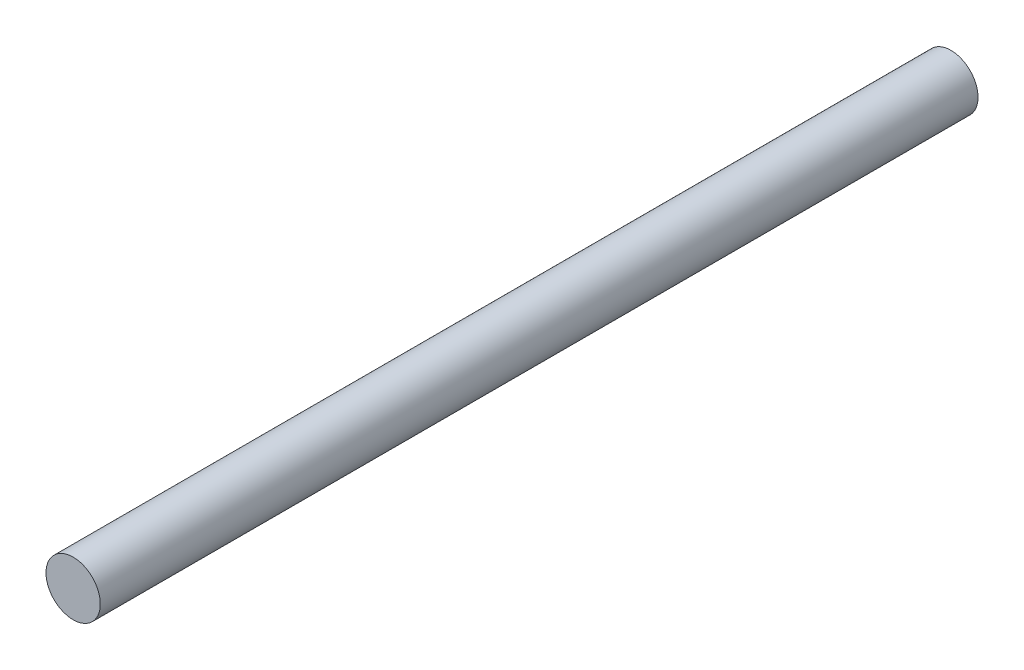
ISO-10303-21;
HEADER;
FILE_DESCRIPTION(('STEP AP214'),'2;1');
FILE_NAME('part.step','',(''),(''),'','','');
FILE_SCHEMA(('AUTOMOTIVE_DESIGN { 1 0 10303 214 1 1 1 1 }'));
ENDSEC;
DATA;
#1=APPLICATION_CONTEXT('core data for automotive mechanical design processes');
#2=APPLICATION_PROTOCOL_DEFINITION('international standard','automotive_design',2000,#1);
#3=PRODUCT_CONTEXT('',#1,'mechanical');
#4=PRODUCT('Part','Part','',(#3));
#5=PRODUCT_RELATED_PRODUCT_CATEGORY('part','',(#4));
#6=PRODUCT_DEFINITION_FORMATION('','',#4);
#7=PRODUCT_DEFINITION_CONTEXT('part definition',#1,'design');
#8=PRODUCT_DEFINITION('design','',#6,#7);
#9=PRODUCT_DEFINITION_SHAPE('','',#8);
#10=(LENGTH_UNIT() NAMED_UNIT(*) SI_UNIT(.MILLI.,.METRE.));
#11=(NAMED_UNIT(*) PLANE_ANGLE_UNIT() SI_UNIT($,.RADIAN.));
#12=(NAMED_UNIT(*) SI_UNIT($,.STERADIAN.) SOLID_ANGLE_UNIT());
#13=UNCERTAINTY_MEASURE_WITH_UNIT(LENGTH_MEASURE(1.E-05),#10,'distance_accuracy_value','');
#14=(GEOMETRIC_REPRESENTATION_CONTEXT(3) GLOBAL_UNCERTAINTY_ASSIGNED_CONTEXT((#13)) GLOBAL_UNIT_ASSIGNED_CONTEXT((#10,
#11,#12)) REPRESENTATION_CONTEXT('',''));
#15=CARTESIAN_POINT('',(0.,0.,0.));
#16=DIRECTION('',(0.,0.,1.));
#17=DIRECTION('',(1.,0.,0.));
#18=AXIS2_PLACEMENT_3D('',#15,#16,#17);
#19=CARTESIAN_POINT('',(0.,0.,97.));
#20=DIRECTION('',(0.,0.,-1.));
#21=DIRECTION('',(-1.,0.,0.));
#22=AXIS2_PLACEMENT_3D('',#19,#20,#21);
#23=CYLINDRICAL_SURFACE('',#22,3.);
#24=CARTESIAN_POINT('',(0.,0.,97.));
#25=DIRECTION('',(0.,0.,1.));
#26=DIRECTION('',(1.,0.,0.));
#27=AXIS2_PLACEMENT_3D('',#24,#25,#26);
#28=CIRCLE('',#27,3.);
#29=CARTESIAN_POINT('',(-3.,0.,97.));
#30=VERTEX_POINT('',#29);
#31=EDGE_CURVE('E10',#30,#30,#28,.T.);
#32=CARTESIAN_POINT('',(0.,0.,0.));
#33=DIRECTION('',(0.,0.,1.));
#34=DIRECTION('',(1.,0.,0.));
#35=AXIS2_PLACEMENT_3D('',#32,#33,#34);
#36=CIRCLE('',#35,3.);
#37=CARTESIAN_POINT('',(-3.,0.,0.));
#38=VERTEX_POINT('',#37);
#39=EDGE_CURVE('E33',#38,#38,#36,.T.);
#40=CARTESIAN_POINT('',(-3.,0.,97.));
#41=CARTESIAN_POINT('',(-3.,0.,95.9895833333333));
#42=CARTESIAN_POINT('',(-3.,0.,94.9791666666667));
#43=CARTESIAN_POINT('',(-3.,0.,92.9583333333333));
#44=CARTESIAN_POINT('',(-3.,0.,91.9479166666667));
#45=CARTESIAN_POINT('',(-3.,0.,89.9270833333333));
#46=CARTESIAN_POINT('',(-3.,0.,88.9166666666667));
#47=CARTESIAN_POINT('',(-3.,0.,86.8958333333333));
#48=CARTESIAN_POINT('',(-3.,0.,85.8854166666667));
#49=CARTESIAN_POINT('',(-3.,0.,83.8645833333333));
#50=CARTESIAN_POINT('',(-3.,0.,82.8541666666667));
#51=CARTESIAN_POINT('',(-3.,0.,80.8333333333333));
#52=CARTESIAN_POINT('',(-3.,0.,79.8229166666667));
#53=CARTESIAN_POINT('',(-3.,0.,77.8020833333333));
#54=CARTESIAN_POINT('',(-3.,0.,76.7916666666667));
#55=CARTESIAN_POINT('',(-3.,0.,74.7708333333333));
#56=CARTESIAN_POINT('',(-3.,0.,73.7604166666667));
#57=CARTESIAN_POINT('',(-3.,0.,71.7395833333333));
#58=CARTESIAN_POINT('',(-3.,0.,70.7291666666667));
#59=CARTESIAN_POINT('',(-3.,0.,68.7083333333333));
#60=CARTESIAN_POINT('',(-3.,0.,67.6979166666666));
#61=CARTESIAN_POINT('',(-3.,0.,65.6770833333333));
#62=CARTESIAN_POINT('',(-3.,0.,64.6666666666667));
#63=CARTESIAN_POINT('',(-3.,0.,62.6458333333333));
#64=CARTESIAN_POINT('',(-3.,0.,61.6354166666667));
#65=CARTESIAN_POINT('',(-3.,0.,59.6145833333333));
#66=CARTESIAN_POINT('',(-3.,0.,58.6041666666667));
#67=CARTESIAN_POINT('',(-3.,0.,56.5833333333333));
#68=CARTESIAN_POINT('',(-3.,0.,55.5729166666667));
#69=CARTESIAN_POINT('',(-3.,0.,53.5520833333333));
#70=CARTESIAN_POINT('',(-3.,0.,52.5416666666667));
#71=CARTESIAN_POINT('',(-3.,0.,50.5208333333333));
#72=CARTESIAN_POINT('',(-3.,0.,49.5104166666667));
#73=CARTESIAN_POINT('',(-3.,0.,47.4895833333333));
#74=CARTESIAN_POINT('',(-3.,0.,46.4791666666667));
#75=CARTESIAN_POINT('',(-3.,0.,44.4583333333333));
#76=CARTESIAN_POINT('',(-3.,0.,43.4479166666667));
#77=CARTESIAN_POINT('',(-3.,0.,41.4270833333333));
#78=CARTESIAN_POINT('',(-3.,0.,40.4166666666667));
#79=CARTESIAN_POINT('',(-3.,0.,38.3958333333333));
#80=CARTESIAN_POINT('',(-3.,0.,37.3854166666667));
#81=CARTESIAN_POINT('',(-3.,0.,35.3645833333333));
#82=CARTESIAN_POINT('',(-3.,0.,34.3541666666667));
#83=CARTESIAN_POINT('',(-3.,0.,32.3333333333333));
#84=CARTESIAN_POINT('',(-3.,0.,31.3229166666667));
#85=CARTESIAN_POINT('',(-3.,0.,29.3020833333333));
#86=CARTESIAN_POINT('',(-3.,0.,28.2916666666667));
#87=CARTESIAN_POINT('',(-3.,0.,26.2708333333333));
#88=CARTESIAN_POINT('',(-3.,0.,25.2604166666667));
#89=CARTESIAN_POINT('',(-3.,0.,23.2395833333333));
#90=CARTESIAN_POINT('',(-3.,0.,22.2291666666667));
#91=CARTESIAN_POINT('',(-3.,0.,20.2083333333333));
#92=CARTESIAN_POINT('',(-3.,0.,19.1979166666667));
#93=CARTESIAN_POINT('',(-3.,0.,17.1770833333333));
#94=CARTESIAN_POINT('',(-3.,0.,16.1666666666667));
#95=CARTESIAN_POINT('',(-3.,0.,14.1458333333333));
#96=CARTESIAN_POINT('',(-3.,0.,13.1354166666667));
#97=CARTESIAN_POINT('',(-3.,0.,11.1145833333333));
#98=CARTESIAN_POINT('',(-3.,0.,10.1041666666667));
#99=CARTESIAN_POINT('',(-3.,0.,8.08333333333332));
#100=CARTESIAN_POINT('',(-3.,0.,7.07291666666665));
#101=CARTESIAN_POINT('',(-3.,0.,5.05208333333332));
#102=CARTESIAN_POINT('',(-3.,0.,4.04166666666665));
#103=CARTESIAN_POINT('',(-3.,0.,2.02083333333332));
#104=CARTESIAN_POINT('',(-3.,0.,1.01041666666665));
#105=CARTESIAN_POINT('',(-3.,0.,0.));
#106=B_SPLINE_CURVE_WITH_KNOTS('',3,(#40,#41,#42,#43,#44,#45,#46,#47,#48,#49,#50,#51,#52,#53,
#54,#55,#56,#57,#58,#59,#60,#61,#62,#63,#64,#65,#66,#67,#68,#69,#70,#71,#72,#73,#74,#75,#76,#77,
#78,#79,#80,#81,#82,#83,#84,#85,#86,#87,#88,#89,#90,#91,#92,#93,#94,#95,#96,#97,#98,#99,#100,
#101,#102,#103,#104,#105),.UNSPECIFIED.,.F.,.F.,(4,2,2,2,2,2,2,2,2,2,2,2,2,2,2,2,2,2,2,2,2,2,2,
2,2,2,2,2,2,2,2,2,4),(0.,3.03125000000001,6.06250000000001,9.09375000000001,12.125,15.15625,
18.1875,21.21875,24.25,27.28125,30.3125,33.34375,36.375,39.40625,42.4375,45.46875,48.5,51.53125,
54.5625,57.59375,60.625,63.65625,66.6875,69.71875,72.75,75.78125,78.8125,81.84375,84.875,
87.90625,90.9375,93.96875,97.),.UNSPECIFIED.);
#107=EDGE_CURVE('BSEAM30',#30,#38,#106,.T.);
#108=ORIENTED_EDGE('',*,*,#31,.F.);
#109=ORIENTED_EDGE('',*,*,#39,.T.);
#110=ORIENTED_EDGE('',*,*,#107,.T.);
#111=ORIENTED_EDGE('',*,*,#107,.F.);
#112=EDGE_LOOP('',(#108,#110,#109,#111));
#113=FACE_BOUND('',#112,.T.);
#114=ADVANCED_FACE('F30',(#113),#23,.T.);
#115=CARTESIAN_POINT('',(0.,0.,97.));
#116=DIRECTION('',(0.,0.,1.));
#117=DIRECTION('',(1.,0.,0.));
#118=AXIS2_PLACEMENT_3D('',#115,#116,#117);
#119=PLANE('',#118);
#120=ORIENTED_EDGE('',*,*,#31,.T.);
#121=EDGE_LOOP('',(#120));
#122=FACE_BOUND('',#121,.T.);
#123=ADVANCED_FACE('F45',(#122),#119,.T.);
#124=CARTESIAN_POINT('',(0.,0.,0.));
#125=DIRECTION('',(0.,0.,1.));
#126=DIRECTION('',(1.,0.,0.));
#127=AXIS2_PLACEMENT_3D('',#124,#125,#126);
#128=PLANE('',#127);
#129=ORIENTED_EDGE('',*,*,#39,.F.);
#130=EDGE_LOOP('',(#129));
#131=FACE_BOUND('',#130,.T.);
#132=ADVANCED_FACE('F43',(#131),#128,.F.);
#133=CLOSED_SHELL('',(#114,#123,#132));
#134=MANIFOLD_SOLID_BREP('B2',#133);
#135=ADVANCED_BREP_SHAPE_REPRESENTATION('',(#18,#134),#14);
#136=SHAPE_DEFINITION_REPRESENTATION(#9,#135);
ENDSEC;
END-ISO-10303-21;
